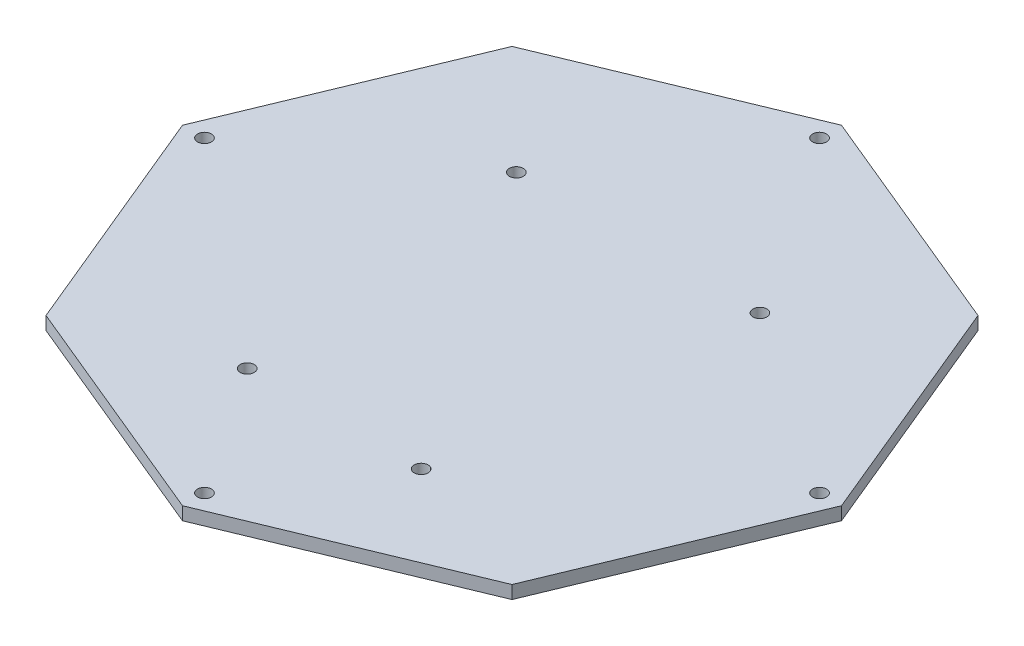
ISO-10303-21;
HEADER;
FILE_DESCRIPTION(('STEP AP214'),'2;1');
FILE_NAME('part.step','',(''),(''),'','','');
FILE_SCHEMA(('AUTOMOTIVE_DESIGN { 1 0 10303 214 1 1 1 1 }'));
ENDSEC;
DATA;
#1=APPLICATION_CONTEXT('core data for automotive mechanical design processes');
#2=APPLICATION_PROTOCOL_DEFINITION('international standard','automotive_design',2000,#1);
#3=PRODUCT_CONTEXT('',#1,'mechanical');
#4=PRODUCT('Part','Part','',(#3));
#5=PRODUCT_RELATED_PRODUCT_CATEGORY('part','',(#4));
#6=PRODUCT_DEFINITION_FORMATION('','',#4);
#7=PRODUCT_DEFINITION_CONTEXT('part definition',#1,'design');
#8=PRODUCT_DEFINITION('design','',#6,#7);
#9=PRODUCT_DEFINITION_SHAPE('','',#8);
#10=(LENGTH_UNIT() NAMED_UNIT(*) SI_UNIT(.MILLI.,.METRE.));
#11=(NAMED_UNIT(*) PLANE_ANGLE_UNIT() SI_UNIT($,.RADIAN.));
#12=(NAMED_UNIT(*) SI_UNIT($,.STERADIAN.) SOLID_ANGLE_UNIT());
#13=UNCERTAINTY_MEASURE_WITH_UNIT(LENGTH_MEASURE(1.E-05),#10,'distance_accuracy_value','');
#14=(GEOMETRIC_REPRESENTATION_CONTEXT(3) GLOBAL_UNCERTAINTY_ASSIGNED_CONTEXT((#13)) GLOBAL_UNIT_ASSIGNED_CONTEXT((#10,
#11,#12)) REPRESENTATION_CONTEXT('',''));
#15=CARTESIAN_POINT('',(0.,0.,0.));
#16=DIRECTION('',(0.,0.,1.));
#17=DIRECTION('',(1.,0.,0.));
#18=AXIS2_PLACEMENT_3D('',#15,#16,#17);
#19=CARTESIAN_POINT('',(-53.575680531112,3.,53.5756805311132));
#20=DIRECTION('',(0.382683432365079,0.,-0.923879532511291));
#21=DIRECTION('',(-0.923879532511291,0.,-0.382683432365079));
#22=AXIS2_PLACEMENT_3D('',#19,#20,#21);
#23=PLANE('',#22);
#24=DIRECTION('',(0.923879532511291,0.,0.382683432365078));
#25=VECTOR('',#24,1.);
#26=CARTESIAN_POINT('',(-53.575680531112,0.,53.5756805311132));
#27=LINE('',#26,#25);
#28=CARTESIAN_POINT('',(-53.575680531112,0.,53.5756805311132));
#29=VERTEX_POINT('',#28);
#30=CARTESIAN_POINT('',(9.15918870307514E-13,0.,75.7674540204676));
#31=VERTEX_POINT('',#30);
#32=EDGE_CURVE('E145',#29,#31,#27,.T.);
#33=ORIENTED_EDGE('',*,*,#32,.T.);
#34=DIRECTION('',(0.,-1.,0.));
#35=VECTOR('',#34,1.);
#36=CARTESIAN_POINT('',(9.15918870307514E-13,3.,75.7674540204676));
#37=LINE('',#36,#35);
#38=CARTESIAN_POINT('',(9.15918870307514E-13,3.,75.7674540204676));
#39=VERTEX_POINT('',#38);
#40=EDGE_CURVE('E11',#39,#31,#37,.T.);
#41=ORIENTED_EDGE('',*,*,#40,.F.);
#42=DIRECTION('',(0.923879532511291,0.,0.382683432365078));
#43=VECTOR('',#42,1.);
#44=CARTESIAN_POINT('',(-53.575680531112,3.,53.5756805311132));
#45=LINE('',#44,#43);
#46=CARTESIAN_POINT('',(-53.575680531112,3.,53.5756805311132));
#47=VERTEX_POINT('',#46);
#48=EDGE_CURVE('E168',#47,#39,#45,.T.);
#49=ORIENTED_EDGE('',*,*,#48,.F.);
#50=DIRECTION('',(0.,-1.,0.));
#51=VECTOR('',#50,1.);
#52=CARTESIAN_POINT('',(-53.575680531112,3.,53.5756805311132));
#53=LINE('',#52,#51);
#54=EDGE_CURVE('E141',#47,#29,#53,.T.);
#55=ORIENTED_EDGE('',*,*,#54,.T.);
#56=EDGE_LOOP('',(#33,#41,#49,#55));
#57=FACE_BOUND('',#56,.T.);
#58=ADVANCED_FACE('F44',(#57),#23,.F.);
#59=CARTESIAN_POINT('',(9.15918870307514E-13,3.,75.7674540204676));
#60=DIRECTION('',(-0.382683432365101,0.,-0.923879532511282));
#61=DIRECTION('',(-0.923879532511282,0.,0.382683432365101));
#62=AXIS2_PLACEMENT_3D('',#59,#60,#61);
#63=PLANE('',#62);
#64=DIRECTION('',(0.923879532511282,0.,-0.382683432365101));
#65=VECTOR('',#64,1.);
#66=CARTESIAN_POINT('',(9.15918870307514E-13,0.,75.7674540204676));
#67=LINE('',#66,#65);
#68=CARTESIAN_POINT('',(53.5756805311132,0.,53.575680531112));
#69=VERTEX_POINT('',#68);
#70=EDGE_CURVE('E149',#31,#69,#67,.T.);
#71=ORIENTED_EDGE('',*,*,#70,.T.);
#72=DIRECTION('',(0.,-1.,0.));
#73=VECTOR('',#72,1.);
#74=CARTESIAN_POINT('',(53.5756805311132,3.,53.575680531112));
#75=LINE('',#74,#73);
#76=CARTESIAN_POINT('',(53.5756805311132,3.,53.575680531112));
#77=VERTEX_POINT('',#76);
#78=EDGE_CURVE('E53',#77,#69,#75,.T.);
#79=ORIENTED_EDGE('',*,*,#78,.F.);
#80=DIRECTION('',(0.923879532511282,0.,-0.382683432365101));
#81=VECTOR('',#80,1.);
#82=CARTESIAN_POINT('',(9.15918870307514E-13,3.,75.7674540204676));
#83=LINE('',#82,#81);
#84=EDGE_CURVE('E104',#39,#77,#83,.T.);
#85=ORIENTED_EDGE('',*,*,#84,.F.);
#86=ORIENTED_EDGE('',*,*,#40,.T.);
#87=EDGE_LOOP('',(#71,#79,#85,#86));
#88=FACE_BOUND('',#87,.T.);
#89=ADVANCED_FACE('F295',(#88),#63,.F.);
#90=CARTESIAN_POINT('',(53.5756805311132,3.,53.575680531112));
#91=DIRECTION('',(-0.923879532511291,0.,-0.382683432365079));
#92=DIRECTION('',(-0.382683432365079,0.,0.923879532511291));
#93=AXIS2_PLACEMENT_3D('',#90,#91,#92);
#94=PLANE('',#93);
#95=DIRECTION('',(0.382683432365079,0.,-0.923879532511291));
#96=VECTOR('',#95,1.);
#97=CARTESIAN_POINT('',(53.5756805311132,0.,53.575680531112));
#98=LINE('',#97,#96);
#99=CARTESIAN_POINT('',(75.7674540204676,0.,-9.08450903914045E-13));
#100=VERTEX_POINT('',#99);
#101=EDGE_CURVE('E153',#69,#100,#98,.T.);
#102=ORIENTED_EDGE('',*,*,#101,.T.);
#103=DIRECTION('',(0.,-1.,0.));
#104=VECTOR('',#103,1.);
#105=CARTESIAN_POINT('',(75.7674540204676,3.,-9.08450903914045E-13));
#106=LINE('',#105,#104);
#107=CARTESIAN_POINT('',(75.7674540204676,3.,-9.08450903914045E-13));
#108=VERTEX_POINT('',#107);
#109=EDGE_CURVE('E179',#108,#100,#106,.T.);
#110=ORIENTED_EDGE('',*,*,#109,.F.);
#111=DIRECTION('',(0.382683432365079,0.,-0.923879532511291));
#112=VECTOR('',#111,1.);
#113=CARTESIAN_POINT('',(53.5756805311132,3.,53.575680531112));
#114=LINE('',#113,#112);
#115=EDGE_CURVE('E189',#77,#108,#114,.T.);
#116=ORIENTED_EDGE('',*,*,#115,.F.);
#117=ORIENTED_EDGE('',*,*,#78,.T.);
#118=EDGE_LOOP('',(#102,#110,#116,#117));
#119=FACE_BOUND('',#118,.T.);
#120=ADVANCED_FACE('F187',(#119),#94,.F.);
#121=CARTESIAN_POINT('',(75.7674540204676,3.,-9.08450903914045E-13));
#122=DIRECTION('',(-0.923879532511282,0.,0.382683432365101));
#123=DIRECTION('',(0.382683432365101,0.,0.923879532511282));
#124=AXIS2_PLACEMENT_3D('',#121,#122,#123);
#125=PLANE('',#124);
#126=DIRECTION('',(-0.382683432365101,0.,-0.923879532511282));
#127=VECTOR('',#126,1.);
#128=CARTESIAN_POINT('',(75.7674540204676,0.,-9.08450903914045E-13));
#129=LINE('',#128,#127);
#130=CARTESIAN_POINT('',(53.575680531112,0.,-53.5756805311132));
#131=VERTEX_POINT('',#130);
#132=EDGE_CURVE('E156',#100,#131,#129,.T.);
#133=ORIENTED_EDGE('',*,*,#132,.T.);
#134=DIRECTION('',(0.,-1.,0.));
#135=VECTOR('',#134,1.);
#136=CARTESIAN_POINT('',(53.575680531112,3.,-53.5756805311132));
#137=LINE('',#136,#135);
#138=CARTESIAN_POINT('',(53.575680531112,3.,-53.5756805311132));
#139=VERTEX_POINT('',#138);
#140=EDGE_CURVE('E175',#139,#131,#137,.T.);
#141=ORIENTED_EDGE('',*,*,#140,.F.);
#142=DIRECTION('',(-0.382683432365101,0.,-0.923879532511282));
#143=VECTOR('',#142,1.);
#144=CARTESIAN_POINT('',(75.7674540204676,3.,-9.08450903914045E-13));
#145=LINE('',#144,#143);
#146=EDGE_CURVE('E202',#108,#139,#145,.T.);
#147=ORIENTED_EDGE('',*,*,#146,.F.);
#148=ORIENTED_EDGE('',*,*,#109,.T.);
#149=EDGE_LOOP('',(#133,#141,#147,#148));
#150=FACE_BOUND('',#149,.T.);
#151=ADVANCED_FACE('F197',(#150),#125,.F.);
#152=CARTESIAN_POINT('',(53.575680531112,3.,-53.5756805311132));
#153=DIRECTION('',(-0.382683432365078,0.,0.923879532511292));
#154=DIRECTION('',(0.923879532511292,0.,0.382683432365078));
#155=AXIS2_PLACEMENT_3D('',#152,#153,#154);
#156=PLANE('',#155);
#157=DIRECTION('',(-0.923879532511292,0.,-0.382683432365078));
#158=VECTOR('',#157,1.);
#159=CARTESIAN_POINT('',(53.575680531112,0.,-53.5756805311132));
#160=LINE('',#159,#158);
#161=CARTESIAN_POINT('',(-9.1021814193436E-13,0.,-75.7674540204676));
#162=VERTEX_POINT('',#161);
#163=EDGE_CURVE('E159',#131,#162,#160,.T.);
#164=ORIENTED_EDGE('',*,*,#163,.T.);
#165=DIRECTION('',(0.,-1.,0.));
#166=VECTOR('',#165,1.);
#167=CARTESIAN_POINT('',(-9.1021814193436E-13,3.,-75.7674540204676));
#168=LINE('',#167,#166);
#169=CARTESIAN_POINT('',(-9.1021814193436E-13,3.,-75.7674540204676));
#170=VERTEX_POINT('',#169);
#171=EDGE_CURVE('E134',#170,#162,#168,.T.);
#172=ORIENTED_EDGE('',*,*,#171,.F.);
#173=DIRECTION('',(-0.923879532511292,0.,-0.382683432365078));
#174=VECTOR('',#173,1.);
#175=CARTESIAN_POINT('',(53.575680531112,3.,-53.5756805311132));
#176=LINE('',#175,#174);
#177=EDGE_CURVE('E123',#139,#170,#176,.T.);
#178=ORIENTED_EDGE('',*,*,#177,.F.);
#179=ORIENTED_EDGE('',*,*,#140,.T.);
#180=EDGE_LOOP('',(#164,#172,#178,#179));
#181=FACE_BOUND('',#180,.T.);
#182=ADVANCED_FACE('F200',(#181),#156,.F.);
#183=CARTESIAN_POINT('',(-9.1021814193436E-13,3.,-75.7674540204676));
#184=DIRECTION('',(0.382683432365101,0.,0.923879532511282));
#185=DIRECTION('',(0.923879532511282,0.,-0.382683432365101));
#186=AXIS2_PLACEMENT_3D('',#183,#184,#185);
#187=PLANE('',#186);
#188=DIRECTION('',(-0.923879532511282,0.,0.382683432365101));
#189=VECTOR('',#188,1.);
#190=CARTESIAN_POINT('',(-9.1021814193436E-13,0.,-75.7674540204676));
#191=LINE('',#190,#189);
#192=CARTESIAN_POINT('',(-53.5756805311132,0.,-53.5756805311119));
#193=VERTEX_POINT('',#192);
#194=EDGE_CURVE('E132',#162,#193,#191,.T.);
#195=ORIENTED_EDGE('',*,*,#194,.T.);
#196=DIRECTION('',(0.,-1.,0.));
#197=VECTOR('',#196,1.);
#198=CARTESIAN_POINT('',(-53.5756805311132,3.,-53.5756805311119));
#199=LINE('',#198,#197);
#200=CARTESIAN_POINT('',(-53.5756805311132,3.,-53.5756805311119));
#201=VERTEX_POINT('',#200);
#202=EDGE_CURVE('E129',#201,#193,#199,.T.);
#203=ORIENTED_EDGE('',*,*,#202,.F.);
#204=DIRECTION('',(-0.923879532511282,0.,0.382683432365101));
#205=VECTOR('',#204,1.);
#206=CARTESIAN_POINT('',(-9.1021814193436E-13,3.,-75.7674540204676));
#207=LINE('',#206,#205);
#208=EDGE_CURVE('E117',#170,#201,#207,.T.);
#209=ORIENTED_EDGE('',*,*,#208,.F.);
#210=ORIENTED_EDGE('',*,*,#171,.T.);
#211=EDGE_LOOP('',(#195,#203,#209,#210));
#212=FACE_BOUND('',#211,.T.);
#213=ADVANCED_FACE('F130',(#212),#187,.F.);
#214=CARTESIAN_POINT('',(-53.5756805311132,3.,-53.5756805311119));
#215=DIRECTION('',(0.923879532511291,0.,0.382683432365079));
#216=DIRECTION('',(0.382683432365079,0.,-0.923879532511291));
#217=AXIS2_PLACEMENT_3D('',#214,#215,#216);
#218=PLANE('',#217);
#219=DIRECTION('',(-0.382683432365078,0.,0.923879532511291));
#220=VECTOR('',#219,1.);
#221=CARTESIAN_POINT('',(-53.5756805311132,0.,-53.5756805311119));
#222=LINE('',#221,#220);
#223=CARTESIAN_POINT('',(-75.7674540204676,0.,9.4753200493085E-13));
#224=VERTEX_POINT('',#223);
#225=EDGE_CURVE('E90',#193,#224,#222,.T.);
#226=ORIENTED_EDGE('',*,*,#225,.T.);
#227=DIRECTION('',(0.,-1.,0.));
#228=VECTOR('',#227,1.);
#229=CARTESIAN_POINT('',(-75.7674540204676,3.,9.4753200493085E-13));
#230=LINE('',#229,#228);
#231=CARTESIAN_POINT('',(-75.7674540204676,3.,9.4753200493085E-13));
#232=VERTEX_POINT('',#231);
#233=EDGE_CURVE('E135',#232,#224,#230,.T.);
#234=ORIENTED_EDGE('',*,*,#233,.F.);
#235=DIRECTION('',(-0.382683432365078,0.,0.923879532511291));
#236=VECTOR('',#235,1.);
#237=CARTESIAN_POINT('',(-53.5756805311132,3.,-53.5756805311119));
#238=LINE('',#237,#236);
#239=EDGE_CURVE('E121',#201,#232,#238,.T.);
#240=ORIENTED_EDGE('',*,*,#239,.F.);
#241=ORIENTED_EDGE('',*,*,#202,.T.);
#242=EDGE_LOOP('',(#226,#234,#240,#241));
#243=FACE_BOUND('',#242,.T.);
#244=ADVANCED_FACE('F137',(#243),#218,.F.);
#245=CARTESIAN_POINT('',(-75.7674540204676,3.,9.4753200493085E-13));
#246=DIRECTION('',(0.923879532511282,0.,-0.382683432365101));
#247=DIRECTION('',(-0.382683432365101,0.,-0.923879532511282));
#248=AXIS2_PLACEMENT_3D('',#245,#246,#247);
#249=PLANE('',#248);
#250=DIRECTION('',(0.382683432365101,0.,0.923879532511282));
#251=VECTOR('',#250,1.);
#252=CARTESIAN_POINT('',(-75.7674540204676,0.,9.4753200493085E-13));
#253=LINE('',#252,#251);
#254=EDGE_CURVE('E96',#224,#29,#253,.T.);
#255=ORIENTED_EDGE('',*,*,#254,.T.);
#256=ORIENTED_EDGE('',*,*,#54,.F.);
#257=DIRECTION('',(0.382683432365101,0.,0.923879532511282));
#258=VECTOR('',#257,1.);
#259=CARTESIAN_POINT('',(-75.7674540204676,3.,9.4753200493085E-13));
#260=LINE('',#259,#258);
#261=EDGE_CURVE('E61',#232,#47,#260,.T.);
#262=ORIENTED_EDGE('',*,*,#261,.F.);
#263=ORIENTED_EDGE('',*,*,#233,.T.);
#264=EDGE_LOOP('',(#255,#256,#262,#263));
#265=FACE_BOUND('',#264,.T.);
#266=ADVANCED_FACE('F302',(#265),#249,.F.);
#267=CARTESIAN_POINT('',(0.,3.,0.));
#268=DIRECTION('',(0.,1.,0.));
#269=DIRECTION('',(0.,0.,1.));
#270=AXIS2_PLACEMENT_3D('',#267,#268,#269);
#271=PLANE('',#270);
#272=CARTESIAN_POINT('',(28.,3.,-29.));
#273=DIRECTION('',(0.,1.,0.));
#274=DIRECTION('',(0.,0.,1.));
#275=AXIS2_PLACEMENT_3D('',#272,#273,#274);
#276=CIRCLE('',#275,1.6);
#277=CARTESIAN_POINT('',(28.,3.,-27.4));
#278=VERTEX_POINT('',#277);
#279=EDGE_CURVE('E233',#278,#278,#276,.T.);
#280=ORIENTED_EDGE('',*,*,#279,.F.);
#281=EDGE_LOOP('',(#280));
#282=FACE_BOUND('',#281,.T.);
#283=CARTESIAN_POINT('',(-28.,3.,-29.));
#284=DIRECTION('',(0.,1.,0.));
#285=DIRECTION('',(0.,0.,1.));
#286=AXIS2_PLACEMENT_3D('',#283,#284,#285);
#287=CIRCLE('',#286,1.6);
#288=CARTESIAN_POINT('',(-28.,3.,-27.4));
#289=VERTEX_POINT('',#288);
#290=EDGE_CURVE('E247',#289,#289,#287,.T.);
#291=ORIENTED_EDGE('',*,*,#290,.F.);
#292=EDGE_LOOP('',(#291));
#293=FACE_BOUND('',#292,.T.);
#294=CARTESIAN_POINT('',(20.1083712431657,3.,41.));
#295=DIRECTION('',(0.,1.,0.));
#296=DIRECTION('',(0.,0.,1.));
#297=AXIS2_PLACEMENT_3D('',#294,#295,#296);
#298=CIRCLE('',#297,1.6);
#299=CARTESIAN_POINT('',(20.1083712431657,3.,42.6));
#300=VERTEX_POINT('',#299);
#301=EDGE_CURVE('E251',#300,#300,#298,.T.);
#302=ORIENTED_EDGE('',*,*,#301,.F.);
#303=EDGE_LOOP('',(#302));
#304=FACE_BOUND('',#303,.T.);
#305=CARTESIAN_POINT('',(-19.8916287568343,3.,41.));
#306=DIRECTION('',(0.,1.,0.));
#307=DIRECTION('',(0.,0.,1.));
#308=AXIS2_PLACEMENT_3D('',#305,#306,#307);
#309=CIRCLE('',#308,1.6);
#310=CARTESIAN_POINT('',(-19.8916287568343,3.,42.6));
#311=VERTEX_POINT('',#310);
#312=EDGE_CURVE('E255',#311,#311,#309,.T.);
#313=ORIENTED_EDGE('',*,*,#312,.F.);
#314=EDGE_LOOP('',(#313));
#315=FACE_BOUND('',#314,.T.);
#316=CARTESIAN_POINT('',(-70.7106781186548,3.,0.));
#317=DIRECTION('',(0.,1.,0.));
#318=DIRECTION('',(0.,0.,1.));
#319=AXIS2_PLACEMENT_3D('',#316,#317,#318);
#320=CIRCLE('',#319,1.60000000000001);
#321=CARTESIAN_POINT('',(-70.7106781186548,3.,1.60000000000001));
#322=VERTEX_POINT('',#321);
#323=EDGE_CURVE('E150',#322,#322,#320,.T.);
#324=ORIENTED_EDGE('',*,*,#323,.F.);
#325=EDGE_LOOP('',(#324));
#326=FACE_BOUND('',#325,.T.);
#327=CARTESIAN_POINT('',(0.,3.,-70.7106781186548));
#328=DIRECTION('',(0.,1.,0.));
#329=DIRECTION('',(0.,0.,1.));
#330=AXIS2_PLACEMENT_3D('',#327,#328,#329);
#331=CIRCLE('',#330,1.60000000000001);
#332=CARTESIAN_POINT('',(0.,3.,-69.1106781186547));
#333=VERTEX_POINT('',#332);
#334=EDGE_CURVE('E215',#333,#333,#331,.T.);
#335=ORIENTED_EDGE('',*,*,#334,.F.);
#336=EDGE_LOOP('',(#335));
#337=FACE_BOUND('',#336,.T.);
#338=CARTESIAN_POINT('',(70.7106781186548,3.,0.));
#339=DIRECTION('',(0.,1.,0.));
#340=DIRECTION('',(0.,0.,1.));
#341=AXIS2_PLACEMENT_3D('',#338,#339,#340);
#342=CIRCLE('',#341,1.60000000000002);
#343=CARTESIAN_POINT('',(70.7106781186548,3.,1.60000000000001));
#344=VERTEX_POINT('',#343);
#345=EDGE_CURVE('E219',#344,#344,#342,.T.);
#346=ORIENTED_EDGE('',*,*,#345,.F.);
#347=EDGE_LOOP('',(#346));
#348=FACE_BOUND('',#347,.T.);
#349=CARTESIAN_POINT('',(0.,3.,70.7106781186548));
#350=DIRECTION('',(0.,1.,0.));
#351=DIRECTION('',(0.,0.,1.));
#352=AXIS2_PLACEMENT_3D('',#349,#350,#351);
#353=CIRCLE('',#352,1.60000000000001);
#354=CARTESIAN_POINT('',(0.,3.,72.3106781186548));
#355=VERTEX_POINT('',#354);
#356=EDGE_CURVE('E223',#355,#355,#353,.T.);
#357=ORIENTED_EDGE('',*,*,#356,.F.);
#358=EDGE_LOOP('',(#357));
#359=FACE_BOUND('',#358,.T.);
#360=ORIENTED_EDGE('',*,*,#48,.T.);
#361=ORIENTED_EDGE('',*,*,#84,.T.);
#362=ORIENTED_EDGE('',*,*,#115,.T.);
#363=ORIENTED_EDGE('',*,*,#146,.T.);
#364=ORIENTED_EDGE('',*,*,#177,.T.);
#365=ORIENTED_EDGE('',*,*,#208,.T.);
#366=ORIENTED_EDGE('',*,*,#239,.T.);
#367=ORIENTED_EDGE('',*,*,#261,.T.);
#368=EDGE_LOOP('',(#360,#361,#362,#363,#364,#365,#366,#367));
#369=FACE_BOUND('',#368,.T.);
#370=ADVANCED_FACE('F119',(#282,#293,#304,#315,#326,#337,#348,#359,#369),#271,.T.);
#371=CARTESIAN_POINT('',(0.,0.,0.));
#372=DIRECTION('',(0.,1.,0.));
#373=DIRECTION('',(0.,0.,1.));
#374=AXIS2_PLACEMENT_3D('',#371,#372,#373);
#375=PLANE('',#374);
#376=CARTESIAN_POINT('',(28.,0.,-29.));
#377=DIRECTION('',(0.,1.,0.));
#378=DIRECTION('',(0.,0.,1.));
#379=AXIS2_PLACEMENT_3D('',#376,#377,#378);
#380=CIRCLE('',#379,1.6);
#381=CARTESIAN_POINT('',(28.,0.,-27.4));
#382=VERTEX_POINT('',#381);
#383=EDGE_CURVE('E264',#382,#382,#380,.T.);
#384=ORIENTED_EDGE('',*,*,#383,.T.);
#385=EDGE_LOOP('',(#384));
#386=FACE_BOUND('',#385,.T.);
#387=CARTESIAN_POINT('',(-28.,0.,-29.));
#388=DIRECTION('',(0.,1.,0.));
#389=DIRECTION('',(0.,0.,1.));
#390=AXIS2_PLACEMENT_3D('',#387,#388,#389);
#391=CIRCLE('',#390,1.6);
#392=CARTESIAN_POINT('',(-28.,0.,-27.4));
#393=VERTEX_POINT('',#392);
#394=EDGE_CURVE('E268',#393,#393,#391,.T.);
#395=ORIENTED_EDGE('',*,*,#394,.T.);
#396=EDGE_LOOP('',(#395));
#397=FACE_BOUND('',#396,.T.);
#398=CARTESIAN_POINT('',(20.1083712431657,0.,41.));
#399=DIRECTION('',(0.,1.,0.));
#400=DIRECTION('',(0.,0.,1.));
#401=AXIS2_PLACEMENT_3D('',#398,#399,#400);
#402=CIRCLE('',#401,1.6);
#403=CARTESIAN_POINT('',(20.1083712431657,0.,42.6));
#404=VERTEX_POINT('',#403);
#405=EDGE_CURVE('E263',#404,#404,#402,.T.);
#406=ORIENTED_EDGE('',*,*,#405,.T.);
#407=EDGE_LOOP('',(#406));
#408=FACE_BOUND('',#407,.T.);
#409=CARTESIAN_POINT('',(-19.8916287568343,0.,41.));
#410=DIRECTION('',(0.,1.,0.));
#411=DIRECTION('',(0.,0.,1.));
#412=AXIS2_PLACEMENT_3D('',#409,#410,#411);
#413=CIRCLE('',#412,1.6);
#414=CARTESIAN_POINT('',(-19.8916287568343,0.,42.6));
#415=VERTEX_POINT('',#414);
#416=EDGE_CURVE('E259',#415,#415,#413,.T.);
#417=ORIENTED_EDGE('',*,*,#416,.T.);
#418=EDGE_LOOP('',(#417));
#419=FACE_BOUND('',#418,.T.);
#420=CARTESIAN_POINT('',(-70.7106781186548,0.,0.));
#421=DIRECTION('',(0.,1.,0.));
#422=DIRECTION('',(0.,0.,-1.));
#423=AXIS2_PLACEMENT_3D('',#420,#421,#422);
#424=CIRCLE('',#423,1.60000000000001);
#425=CARTESIAN_POINT('',(-70.7106781186548,0.,-1.6));
#426=VERTEX_POINT('',#425);
#427=EDGE_CURVE('E227',#426,#426,#424,.T.);
#428=ORIENTED_EDGE('',*,*,#427,.T.);
#429=EDGE_LOOP('',(#428));
#430=FACE_BOUND('',#429,.T.);
#431=CARTESIAN_POINT('',(0.,0.,-70.7106781186548));
#432=DIRECTION('',(0.,1.,0.));
#433=DIRECTION('',(0.,0.,-1.));
#434=AXIS2_PLACEMENT_3D('',#431,#432,#433);
#435=CIRCLE('',#434,1.60000000000001);
#436=CARTESIAN_POINT('',(0.,0.,-72.3106781186548));
#437=VERTEX_POINT('',#436);
#438=EDGE_CURVE('E237',#437,#437,#435,.T.);
#439=ORIENTED_EDGE('',*,*,#438,.T.);
#440=EDGE_LOOP('',(#439));
#441=FACE_BOUND('',#440,.T.);
#442=CARTESIAN_POINT('',(70.7106781186548,0.,0.));
#443=DIRECTION('',(0.,1.,0.));
#444=DIRECTION('',(0.,0.,-1.));
#445=AXIS2_PLACEMENT_3D('',#442,#443,#444);
#446=CIRCLE('',#445,1.60000000000002);
#447=CARTESIAN_POINT('',(70.7106781186548,0.,-1.60000000000003));
#448=VERTEX_POINT('',#447);
#449=EDGE_CURVE('E232',#448,#448,#446,.T.);
#450=ORIENTED_EDGE('',*,*,#449,.T.);
#451=EDGE_LOOP('',(#450));
#452=FACE_BOUND('',#451,.T.);
#453=CARTESIAN_POINT('',(0.,0.,70.7106781186548));
#454=DIRECTION('',(0.,1.,0.));
#455=DIRECTION('',(0.,0.,-1.));
#456=AXIS2_PLACEMENT_3D('',#453,#454,#455);
#457=CIRCLE('',#456,1.60000000000001);
#458=CARTESIAN_POINT('',(0.,0.,69.1106781186547));
#459=VERTEX_POINT('',#458);
#460=EDGE_CURVE('E228',#459,#459,#457,.T.);
#461=ORIENTED_EDGE('',*,*,#460,.T.);
#462=EDGE_LOOP('',(#461));
#463=FACE_BOUND('',#462,.T.);
#464=ORIENTED_EDGE('',*,*,#32,.F.);
#465=ORIENTED_EDGE('',*,*,#254,.F.);
#466=ORIENTED_EDGE('',*,*,#225,.F.);
#467=ORIENTED_EDGE('',*,*,#194,.F.);
#468=ORIENTED_EDGE('',*,*,#163,.F.);
#469=ORIENTED_EDGE('',*,*,#132,.F.);
#470=ORIENTED_EDGE('',*,*,#101,.F.);
#471=ORIENTED_EDGE('',*,*,#70,.F.);
#472=EDGE_LOOP('',(#464,#465,#466,#467,#468,#469,#470,#471));
#473=FACE_BOUND('',#472,.T.);
#474=ADVANCED_FACE('F193',(#386,#397,#408,#419,#430,#441,#452,#463,#473),#375,.F.);
#475=CARTESIAN_POINT('',(0.,0.,70.7106781186548));
#476=DIRECTION('',(0.,1.,0.));
#477=DIRECTION('',(0.,0.,1.));
#478=AXIS2_PLACEMENT_3D('',#475,#476,#477);
#479=CYLINDRICAL_SURFACE('',#478,1.60000000000001);
#480=ORIENTED_EDGE('',*,*,#356,.T.);
#481=EDGE_LOOP('',(#480));
#482=FACE_BOUND('',#481,.T.);
#483=ORIENTED_EDGE('',*,*,#460,.F.);
#484=EDGE_LOOP('',(#483));
#485=FACE_BOUND('',#484,.T.);
#486=ADVANCED_FACE('F367',(#482,#485),#479,.F.);
#487=CARTESIAN_POINT('',(70.7106781186548,0.,0.));
#488=DIRECTION('',(0.,1.,0.));
#489=DIRECTION('',(0.,0.,1.));
#490=AXIS2_PLACEMENT_3D('',#487,#488,#489);
#491=CYLINDRICAL_SURFACE('',#490,1.60000000000002);
#492=ORIENTED_EDGE('',*,*,#345,.T.);
#493=EDGE_LOOP('',(#492));
#494=FACE_BOUND('',#493,.T.);
#495=ORIENTED_EDGE('',*,*,#449,.F.);
#496=EDGE_LOOP('',(#495));
#497=FACE_BOUND('',#496,.T.);
#498=ADVANCED_FACE('F375',(#494,#497),#491,.F.);
#499=CARTESIAN_POINT('',(0.,0.,-70.7106781186548));
#500=DIRECTION('',(0.,1.,0.));
#501=DIRECTION('',(0.,0.,1.));
#502=AXIS2_PLACEMENT_3D('',#499,#500,#501);
#503=CYLINDRICAL_SURFACE('',#502,1.60000000000001);
#504=ORIENTED_EDGE('',*,*,#334,.T.);
#505=EDGE_LOOP('',(#504));
#506=FACE_BOUND('',#505,.T.);
#507=ORIENTED_EDGE('',*,*,#438,.F.);
#508=EDGE_LOOP('',(#507));
#509=FACE_BOUND('',#508,.T.);
#510=ADVANCED_FACE('F385',(#506,#509),#503,.F.);
#511=CARTESIAN_POINT('',(-70.7106781186548,0.,0.));
#512=DIRECTION('',(0.,1.,0.));
#513=DIRECTION('',(0.,0.,1.));
#514=AXIS2_PLACEMENT_3D('',#511,#512,#513);
#515=CYLINDRICAL_SURFACE('',#514,1.60000000000001);
#516=ORIENTED_EDGE('',*,*,#323,.T.);
#517=EDGE_LOOP('',(#516));
#518=FACE_BOUND('',#517,.T.);
#519=ORIENTED_EDGE('',*,*,#427,.F.);
#520=EDGE_LOOP('',(#519));
#521=FACE_BOUND('',#520,.T.);
#522=ADVANCED_FACE('F291',(#518,#521),#515,.F.);
#523=CARTESIAN_POINT('',(-19.8916287568343,0.,41.));
#524=DIRECTION('',(0.,1.,0.));
#525=DIRECTION('',(0.,0.,1.));
#526=AXIS2_PLACEMENT_3D('',#523,#524,#525);
#527=CYLINDRICAL_SURFACE('',#526,1.6);
#528=ORIENTED_EDGE('',*,*,#312,.T.);
#529=EDGE_LOOP('',(#528));
#530=FACE_BOUND('',#529,.T.);
#531=ORIENTED_EDGE('',*,*,#416,.F.);
#532=EDGE_LOOP('',(#531));
#533=FACE_BOUND('',#532,.T.);
#534=ADVANCED_FACE('F281',(#530,#533),#527,.F.);
#535=CARTESIAN_POINT('',(20.1083712431657,0.,41.));
#536=DIRECTION('',(0.,1.,0.));
#537=DIRECTION('',(0.,0.,1.));
#538=AXIS2_PLACEMENT_3D('',#535,#536,#537);
#539=CYLINDRICAL_SURFACE('',#538,1.6);
#540=ORIENTED_EDGE('',*,*,#301,.T.);
#541=EDGE_LOOP('',(#540));
#542=FACE_BOUND('',#541,.T.);
#543=ORIENTED_EDGE('',*,*,#405,.F.);
#544=EDGE_LOOP('',(#543));
#545=FACE_BOUND('',#544,.T.);
#546=ADVANCED_FACE('F278',(#542,#545),#539,.F.);
#547=CARTESIAN_POINT('',(-28.,0.,-29.));
#548=DIRECTION('',(0.,1.,0.));
#549=DIRECTION('',(0.,0.,1.));
#550=AXIS2_PLACEMENT_3D('',#547,#548,#549);
#551=CYLINDRICAL_SURFACE('',#550,1.6);
#552=ORIENTED_EDGE('',*,*,#290,.T.);
#553=EDGE_LOOP('',(#552));
#554=FACE_BOUND('',#553,.T.);
#555=ORIENTED_EDGE('',*,*,#394,.F.);
#556=EDGE_LOOP('',(#555));
#557=FACE_BOUND('',#556,.T.);
#558=ADVANCED_FACE('F280',(#554,#557),#551,.F.);
#559=CARTESIAN_POINT('',(28.,0.,-29.));
#560=DIRECTION('',(0.,1.,0.));
#561=DIRECTION('',(0.,0.,1.));
#562=AXIS2_PLACEMENT_3D('',#559,#560,#561);
#563=CYLINDRICAL_SURFACE('',#562,1.6);
#564=ORIENTED_EDGE('',*,*,#279,.T.);
#565=EDGE_LOOP('',(#564));
#566=FACE_BOUND('',#565,.T.);
#567=ORIENTED_EDGE('',*,*,#383,.F.);
#568=EDGE_LOOP('',(#567));
#569=FACE_BOUND('',#568,.T.);
#570=ADVANCED_FACE('F288',(#566,#569),#563,.F.);
#571=CLOSED_SHELL('',(#58,#89,#120,#151,#182,#213,#244,#266,#370,#474,#486,#498,#510,#522,#534,
#546,#558,#570));
#572=MANIFOLD_SOLID_BREP('B2',#571);
#573=ADVANCED_BREP_SHAPE_REPRESENTATION('',(#18,#572),#14);
#574=SHAPE_DEFINITION_REPRESENTATION(#9,#573);
ENDSEC;
END-ISO-10303-21;
